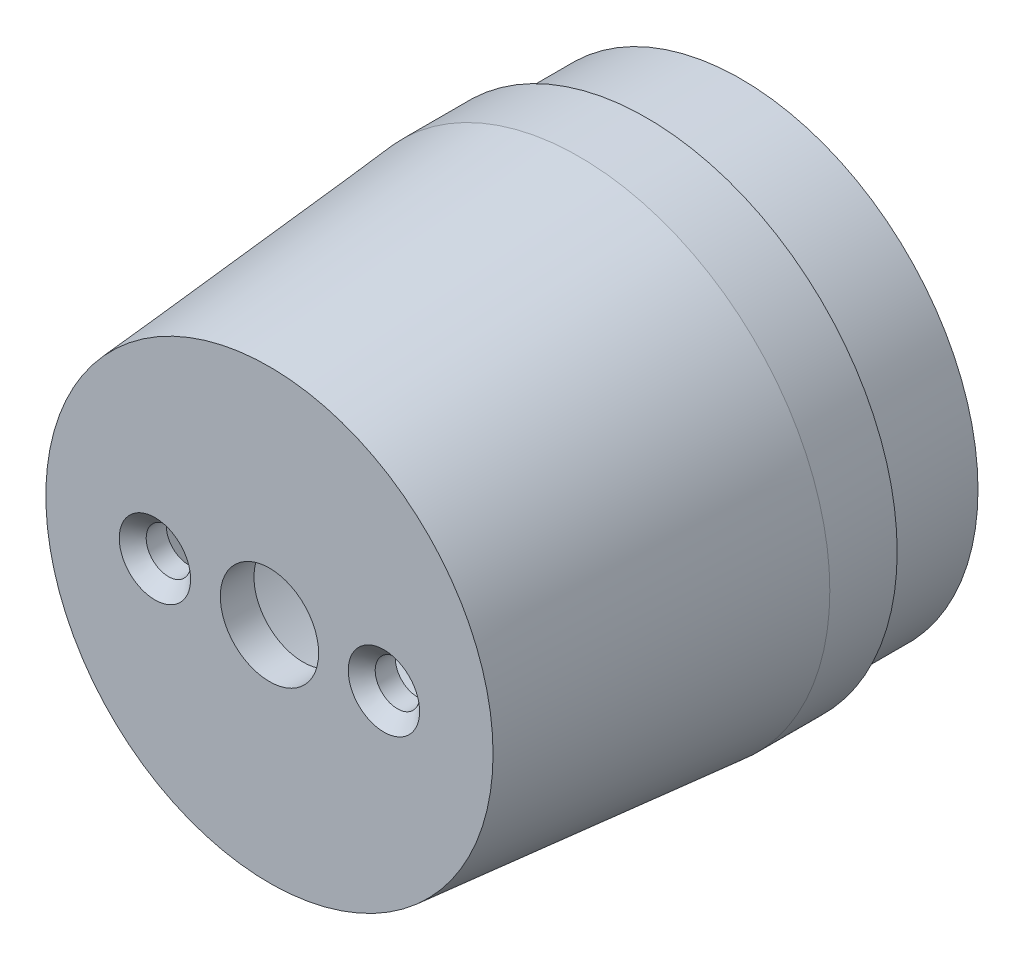
ISO-10303-21;
HEADER;
FILE_DESCRIPTION(('STEP AP214'),'2;1');
FILE_NAME('part.step','',(''),(''),'','','');
FILE_SCHEMA(('AUTOMOTIVE_DESIGN { 1 0 10303 214 1 1 1 1 }'));
ENDSEC;
DATA;
#1=APPLICATION_CONTEXT('core data for automotive mechanical design processes');
#2=APPLICATION_PROTOCOL_DEFINITION('international standard','automotive_design',2000,#1);
#3=PRODUCT_CONTEXT('',#1,'mechanical');
#4=PRODUCT('Part','Part','',(#3));
#5=PRODUCT_RELATED_PRODUCT_CATEGORY('part','',(#4));
#6=PRODUCT_DEFINITION_FORMATION('','',#4);
#7=PRODUCT_DEFINITION_CONTEXT('part definition',#1,'design');
#8=PRODUCT_DEFINITION('design','',#6,#7);
#9=PRODUCT_DEFINITION_SHAPE('','',#8);
#10=(LENGTH_UNIT() NAMED_UNIT(*) SI_UNIT(.MILLI.,.METRE.));
#11=(NAMED_UNIT(*) PLANE_ANGLE_UNIT() SI_UNIT($,.RADIAN.));
#12=(NAMED_UNIT(*) SI_UNIT($,.STERADIAN.) SOLID_ANGLE_UNIT());
#13=UNCERTAINTY_MEASURE_WITH_UNIT(LENGTH_MEASURE(1.E-05),#10,'distance_accuracy_value','');
#14=(GEOMETRIC_REPRESENTATION_CONTEXT(3) GLOBAL_UNCERTAINTY_ASSIGNED_CONTEXT((#13)) GLOBAL_UNIT_ASSIGNED_CONTEXT((#10,
#11,#12)) REPRESENTATION_CONTEXT('',''));
#15=CARTESIAN_POINT('',(0.,0.,0.));
#16=DIRECTION('',(0.,0.,1.));
#17=DIRECTION('',(1.,0.,0.));
#18=AXIS2_PLACEMENT_3D('',#15,#16,#17);
#19=CARTESIAN_POINT('',(0.,0.,0.));
#20=DIRECTION('',(0.,0.,1.));
#21=DIRECTION('',(1.,0.,0.));
#22=AXIS2_PLACEMENT_3D('',#19,#20,#21);
#23=CYLINDRICAL_SURFACE('',#22,18.6);
#24=CARTESIAN_POINT('',(0.,0.,-18.));
#25=DIRECTION('',(0.,0.,1.));
#26=DIRECTION('',(1.,0.,0.));
#27=AXIS2_PLACEMENT_3D('',#24,#25,#26);
#28=CIRCLE('',#27,18.6);
#29=CARTESIAN_POINT('',(18.6,0.,-18.));
#30=VERTEX_POINT('',#29);
#31=EDGE_CURVE('E66',#30,#30,#28,.T.);
#32=ORIENTED_EDGE('',*,*,#31,.T.);
#33=EDGE_LOOP('',(#32));
#34=FACE_BOUND('',#33,.T.);
#35=CARTESIAN_POINT('',(0.,0.,-13.));
#36=DIRECTION('',(0.,0.,1.));
#37=DIRECTION('',(1.,0.,0.));
#38=AXIS2_PLACEMENT_3D('',#35,#36,#37);
#39=CIRCLE('',#38,18.6);
#40=CARTESIAN_POINT('',(18.6,0.,-13.));
#41=VERTEX_POINT('',#40);
#42=EDGE_CURVE('E106',#41,#41,#39,.T.);
#43=ORIENTED_EDGE('',*,*,#42,.F.);
#44=EDGE_LOOP('',(#43));
#45=FACE_BOUND('',#44,.T.);
#46=ADVANCED_FACE('F32',(#34,#45),#23,.T.);
#47=CARTESIAN_POINT('',(0.,18.6,10.));
#48=DIRECTION('',(0.,0.,-1.));
#49=DIRECTION('',(-1.,0.,0.));
#50=AXIS2_PLACEMENT_3D('',#47,#48,#49);
#51=PLANE('',#50);
#52=CARTESIAN_POINT('',(0.,0.,10.));
#53=DIRECTION('',(0.,0.,1.));
#54=DIRECTION('',(1.,0.,0.));
#55=AXIS2_PLACEMENT_3D('',#52,#53,#54);
#56=CIRCLE('',#55,3.65);
#57=CARTESIAN_POINT('',(3.65,0.,10.));
#58=VERTEX_POINT('',#57);
#59=EDGE_CURVE('E69',#58,#58,#56,.T.);
#60=ORIENTED_EDGE('',*,*,#59,.F.);
#61=EDGE_LOOP('',(#60));
#62=FACE_BOUND('',#61,.T.);
#63=CARTESIAN_POINT('',(8.5,0.,10.));
#64=DIRECTION('',(0.,0.,-1.));
#65=DIRECTION('',(-1.,0.,0.));
#66=AXIS2_PLACEMENT_3D('',#63,#64,#65);
#67=CIRCLE('',#66,2.64999999999999);
#68=CARTESIAN_POINT('',(5.85000000000001,0.,10.));
#69=VERTEX_POINT('',#68);
#70=EDGE_CURVE('E43',#69,#69,#67,.T.);
#71=ORIENTED_EDGE('',*,*,#70,.T.);
#72=EDGE_LOOP('',(#71));
#73=FACE_BOUND('',#72,.T.);
#74=CARTESIAN_POINT('',(-8.5,0.,10.));
#75=DIRECTION('',(0.,0.,-1.));
#76=DIRECTION('',(-1.,0.,0.));
#77=AXIS2_PLACEMENT_3D('',#74,#75,#76);
#78=CIRCLE('',#77,2.65000000000001);
#79=CARTESIAN_POINT('',(-11.15,0.,10.));
#80=VERTEX_POINT('',#79);
#81=EDGE_CURVE('E39',#80,#80,#78,.T.);
#82=ORIENTED_EDGE('',*,*,#81,.T.);
#83=EDGE_LOOP('',(#82));
#84=FACE_BOUND('',#83,.T.);
#85=CARTESIAN_POINT('',(0.,0.,10.));
#86=DIRECTION('',(0.,0.,1.));
#87=DIRECTION('',(1.,0.,0.));
#88=AXIS2_PLACEMENT_3D('',#85,#86,#87);
#89=CIRCLE('',#88,16.6);
#90=CARTESIAN_POINT('',(16.6,0.,10.));
#91=VERTEX_POINT('',#90);
#92=EDGE_CURVE('E90',#91,#91,#89,.T.);
#93=ORIENTED_EDGE('',*,*,#92,.T.);
#94=EDGE_LOOP('',(#93));
#95=FACE_BOUND('',#94,.T.);
#96=ADVANCED_FACE('F114',(#62,#73,#84,#95),#51,.F.);
#97=CARTESIAN_POINT('',(0.,12.7,-25.));
#98=DIRECTION('',(0.,0.,1.));
#99=DIRECTION('',(1.,0.,0.));
#100=AXIS2_PLACEMENT_3D('',#97,#98,#99);
#101=PLANE('',#100);
#102=CARTESIAN_POINT('',(-10.6066017177982,10.6066017177982,-25.));
#103=DIRECTION('',(0.,0.,-1.));
#104=DIRECTION('',(-1.,0.,0.));
#105=AXIS2_PLACEMENT_3D('',#102,#103,#104);
#106=CIRCLE('',#105,1.00000000000002);
#107=CARTESIAN_POINT('',(-11.6066017177982,10.6066017177982,-25.));
#108=VERTEX_POINT('',#107);
#109=EDGE_CURVE('E99',#108,#108,#106,.T.);
#110=ORIENTED_EDGE('',*,*,#109,.F.);
#111=EDGE_LOOP('',(#110));
#112=FACE_BOUND('',#111,.T.);
#113=CARTESIAN_POINT('',(-10.6066017177982,-10.6066017177982,-25.));
#114=DIRECTION('',(0.,0.,-1.));
#115=DIRECTION('',(-1.,0.,0.));
#116=AXIS2_PLACEMENT_3D('',#113,#114,#115);
#117=CIRCLE('',#116,1.00000000000007);
#118=CARTESIAN_POINT('',(-11.6066017177983,-10.6066017177982,-25.));
#119=VERTEX_POINT('',#118);
#120=EDGE_CURVE('E93',#119,#119,#117,.T.);
#121=ORIENTED_EDGE('',*,*,#120,.F.);
#122=EDGE_LOOP('',(#121));
#123=FACE_BOUND('',#122,.T.);
#124=CARTESIAN_POINT('',(10.6066017177982,-10.6066017177982,-25.));
#125=DIRECTION('',(0.,0.,-1.));
#126=DIRECTION('',(-1.,0.,0.));
#127=AXIS2_PLACEMENT_3D('',#124,#125,#126);
#128=CIRCLE('',#127,1.00000000000012);
#129=CARTESIAN_POINT('',(9.60660171779809,-10.6066017177982,-25.));
#130=VERTEX_POINT('',#129);
#131=EDGE_CURVE('E86',#130,#130,#128,.T.);
#132=ORIENTED_EDGE('',*,*,#131,.F.);
#133=EDGE_LOOP('',(#132));
#134=FACE_BOUND('',#133,.T.);
#135=CARTESIAN_POINT('',(10.6066017177982,10.6066017177982,-25.));
#136=DIRECTION('',(0.,0.,-1.));
#137=DIRECTION('',(-1.,0.,0.));
#138=AXIS2_PLACEMENT_3D('',#135,#136,#137);
#139=CIRCLE('',#138,1.);
#140=CARTESIAN_POINT('',(9.60660171779823,10.6066017177982,-25.));
#141=VERTEX_POINT('',#140);
#142=EDGE_CURVE('E80',#141,#141,#139,.T.);
#143=ORIENTED_EDGE('',*,*,#142,.F.);
#144=EDGE_LOOP('',(#143));
#145=FACE_BOUND('',#144,.T.);
#146=CARTESIAN_POINT('',(0.,0.,-25.));
#147=DIRECTION('',(0.,0.,1.));
#148=DIRECTION('',(1.,0.,0.));
#149=AXIS2_PLACEMENT_3D('',#146,#147,#148);
#150=CIRCLE('',#149,17.6);
#151=CARTESIAN_POINT('',(17.6,0.,-25.));
#152=VERTEX_POINT('',#151);
#153=EDGE_CURVE('E52',#152,#152,#150,.T.);
#154=ORIENTED_EDGE('',*,*,#153,.F.);
#155=EDGE_LOOP('',(#154));
#156=FACE_BOUND('',#155,.T.);
#157=CARTESIAN_POINT('',(0.,0.,-25.));
#158=DIRECTION('',(0.,0.,1.));
#159=DIRECTION('',(1.,0.,0.));
#160=AXIS2_PLACEMENT_3D('',#157,#158,#159);
#161=CIRCLE('',#160,12.7);
#162=CARTESIAN_POINT('',(12.7,0.,-25.));
#163=VERTEX_POINT('',#162);
#164=EDGE_CURVE('E60',#163,#163,#161,.T.);
#165=ORIENTED_EDGE('',*,*,#164,.T.);
#166=EDGE_LOOP('',(#165));
#167=FACE_BOUND('',#166,.T.);
#168=ADVANCED_FACE('F120',(#112,#123,#134,#145,#156,#167),#101,.F.);
#169=CARTESIAN_POINT('',(0.,0.,0.));
#170=DIRECTION('',(0.,0.,1.));
#171=DIRECTION('',(1.,0.,0.));
#172=AXIS2_PLACEMENT_3D('',#169,#170,#171);
#173=CYLINDRICAL_SURFACE('',#172,17.6);
#174=CARTESIAN_POINT('',(0.,0.,-18.));
#175=DIRECTION('',(0.,0.,1.));
#176=DIRECTION('',(1.,0.,0.));
#177=AXIS2_PLACEMENT_3D('',#174,#175,#176);
#178=CIRCLE('',#177,17.6);
#179=CARTESIAN_POINT('',(17.6,0.,-18.));
#180=VERTEX_POINT('',#179);
#181=EDGE_CURVE('E63',#180,#180,#178,.T.);
#182=ORIENTED_EDGE('',*,*,#181,.F.);
#183=EDGE_LOOP('',(#182));
#184=FACE_BOUND('',#183,.T.);
#185=ORIENTED_EDGE('',*,*,#153,.T.);
#186=EDGE_LOOP('',(#185));
#187=FACE_BOUND('',#186,.T.);
#188=ADVANCED_FACE('F129',(#184,#187),#173,.T.);
#189=CARTESIAN_POINT('',(0.,17.6,-18.));
#190=DIRECTION('',(0.,0.,1.));
#191=DIRECTION('',(1.,0.,0.));
#192=AXIS2_PLACEMENT_3D('',#189,#190,#191);
#193=PLANE('',#192);
#194=ORIENTED_EDGE('',*,*,#31,.F.);
#195=EDGE_LOOP('',(#194));
#196=FACE_BOUND('',#195,.T.);
#197=ORIENTED_EDGE('',*,*,#181,.T.);
#198=EDGE_LOOP('',(#197));
#199=FACE_BOUND('',#198,.T.);
#200=ADVANCED_FACE('F125',(#196,#199),#193,.F.);
#201=CARTESIAN_POINT('',(0.,0.,0.));
#202=DIRECTION('',(0.,0.,1.));
#203=DIRECTION('',(1.,0.,0.));
#204=AXIS2_PLACEMENT_3D('',#201,#202,#203);
#205=CYLINDRICAL_SURFACE('',#204,3.65);
#206=CARTESIAN_POINT('',(0.,0.,7.5));
#207=DIRECTION('',(0.,0.,1.));
#208=DIRECTION('',(1.,0.,0.));
#209=AXIS2_PLACEMENT_3D('',#206,#207,#208);
#210=CIRCLE('',#209,3.65);
#211=CARTESIAN_POINT('',(3.65,0.,7.5));
#212=VERTEX_POINT('',#211);
#213=EDGE_CURVE('E72',#212,#212,#210,.T.);
#214=ORIENTED_EDGE('',*,*,#213,.F.);
#215=EDGE_LOOP('',(#214));
#216=FACE_BOUND('',#215,.T.);
#217=ORIENTED_EDGE('',*,*,#59,.T.);
#218=EDGE_LOOP('',(#217));
#219=FACE_BOUND('',#218,.T.);
#220=ADVANCED_FACE('F128',(#216,#219),#205,.F.);
#221=CARTESIAN_POINT('',(0.,3.65,7.5));
#222=DIRECTION('',(0.,0.,1.));
#223=DIRECTION('',(1.,0.,0.));
#224=AXIS2_PLACEMENT_3D('',#221,#222,#223);
#225=PLANE('',#224);
#226=CARTESIAN_POINT('',(-8.5,0.,7.5));
#227=DIRECTION('',(0.,0.,1.));
#228=DIRECTION('',(1.,0.,0.));
#229=AXIS2_PLACEMENT_3D('',#226,#227,#228);
#230=CIRCLE('',#229,1.65);
#231=CARTESIAN_POINT('',(-6.85,0.,7.5));
#232=VERTEX_POINT('',#231);
#233=EDGE_CURVE('E53',#232,#232,#230,.T.);
#234=ORIENTED_EDGE('',*,*,#233,.T.);
#235=EDGE_LOOP('',(#234));
#236=FACE_BOUND('',#235,.T.);
#237=CARTESIAN_POINT('',(8.5,0.,7.5));
#238=DIRECTION('',(0.,0.,1.));
#239=DIRECTION('',(1.,0.,0.));
#240=AXIS2_PLACEMENT_3D('',#237,#238,#239);
#241=CIRCLE('',#240,1.65);
#242=CARTESIAN_POINT('',(10.15,0.,7.5));
#243=VERTEX_POINT('',#242);
#244=EDGE_CURVE('E56',#243,#243,#241,.T.);
#245=ORIENTED_EDGE('',*,*,#244,.T.);
#246=EDGE_LOOP('',(#245));
#247=FACE_BOUND('',#246,.T.);
#248=CARTESIAN_POINT('',(0.,0.,7.5));
#249=DIRECTION('',(0.,0.,1.));
#250=DIRECTION('',(1.,0.,0.));
#251=AXIS2_PLACEMENT_3D('',#248,#249,#250);
#252=CIRCLE('',#251,12.7);
#253=CARTESIAN_POINT('',(12.7,0.,7.5));
#254=VERTEX_POINT('',#253);
#255=EDGE_CURVE('E75',#254,#254,#252,.T.);
#256=ORIENTED_EDGE('',*,*,#255,.F.);
#257=EDGE_LOOP('',(#256));
#258=FACE_BOUND('',#257,.T.);
#259=ORIENTED_EDGE('',*,*,#213,.T.);
#260=EDGE_LOOP('',(#259));
#261=FACE_BOUND('',#260,.T.);
#262=ADVANCED_FACE('F154',(#236,#247,#258,#261),#225,.F.);
#263=CARTESIAN_POINT('',(0.,0.,0.));
#264=DIRECTION('',(0.,0.,1.));
#265=DIRECTION('',(1.,0.,0.));
#266=AXIS2_PLACEMENT_3D('',#263,#264,#265);
#267=CYLINDRICAL_SURFACE('',#266,12.7);
#268=ORIENTED_EDGE('',*,*,#164,.F.);
#269=EDGE_LOOP('',(#268));
#270=FACE_BOUND('',#269,.T.);
#271=ORIENTED_EDGE('',*,*,#255,.T.);
#272=EDGE_LOOP('',(#271));
#273=FACE_BOUND('',#272,.T.);
#274=ADVANCED_FACE('F157',(#270,#273),#267,.F.);
#275=CARTESIAN_POINT('',(8.5,0.,5.5));
#276=DIRECTION('',(0.,0.,1.));
#277=DIRECTION('',(1.,0.,0.));
#278=AXIS2_PLACEMENT_3D('',#275,#276,#277);
#279=CYLINDRICAL_SURFACE('',#278,1.65);
#280=CARTESIAN_POINT('',(8.5,0.,9.00000000000001));
#281=DIRECTION('',(0.,0.,-1.));
#282=DIRECTION('',(-1.,0.,0.));
#283=AXIS2_PLACEMENT_3D('',#280,#281,#282);
#284=CIRCLE('',#283,1.65);
#285=CARTESIAN_POINT('',(6.85,0.,9.00000000000001));
#286=VERTEX_POINT('',#285);
#287=EDGE_CURVE('E10',#286,#286,#284,.F.);
#288=ORIENTED_EDGE('',*,*,#287,.T.);
#289=EDGE_LOOP('',(#288));
#290=FACE_BOUND('',#289,.T.);
#291=ORIENTED_EDGE('',*,*,#244,.F.);
#292=EDGE_LOOP('',(#291));
#293=FACE_BOUND('',#292,.T.);
#294=ADVANCED_FACE('F146',(#290,#293),#279,.F.);
#295=CARTESIAN_POINT('',(-8.5,0.,5.5));
#296=DIRECTION('',(0.,0.,1.));
#297=DIRECTION('',(1.,0.,0.));
#298=AXIS2_PLACEMENT_3D('',#295,#296,#297);
#299=CYLINDRICAL_SURFACE('',#298,1.65);
#300=CARTESIAN_POINT('',(-8.5,0.,9.));
#301=DIRECTION('',(0.,0.,-1.));
#302=DIRECTION('',(-1.,0.,0.));
#303=AXIS2_PLACEMENT_3D('',#300,#301,#302);
#304=CIRCLE('',#303,1.65);
#305=CARTESIAN_POINT('',(-10.15,0.,9.));
#306=VERTEX_POINT('',#305);
#307=EDGE_CURVE('E47',#306,#306,#304,.F.);
#308=ORIENTED_EDGE('',*,*,#307,.T.);
#309=EDGE_LOOP('',(#308));
#310=FACE_BOUND('',#309,.T.);
#311=ORIENTED_EDGE('',*,*,#233,.F.);
#312=EDGE_LOOP('',(#311));
#313=FACE_BOUND('',#312,.T.);
#314=ADVANCED_FACE('F138',(#310,#313),#299,.F.);
#315=CARTESIAN_POINT('',(-8.5,0.,9.));
#316=DIRECTION('',(0.,0.,1.));
#317=DIRECTION('',(1.,0.,0.));
#318=AXIS2_PLACEMENT_3D('',#315,#316,#317);
#319=CONICAL_SURFACE('',#318,1.65,0.785398163397452);
#320=ORIENTED_EDGE('',*,*,#81,.F.);
#321=EDGE_LOOP('',(#320));
#322=FACE_BOUND('',#321,.T.);
#323=ORIENTED_EDGE('',*,*,#307,.F.);
#324=EDGE_LOOP('',(#323));
#325=FACE_BOUND('',#324,.T.);
#326=ADVANCED_FACE('F136',(#322,#325),#319,.F.);
#327=CARTESIAN_POINT('',(8.5,0.,9.00000000000001));
#328=DIRECTION('',(0.,0.,1.));
#329=DIRECTION('',(1.,0.,0.));
#330=AXIS2_PLACEMENT_3D('',#327,#328,#329);
#331=CONICAL_SURFACE('',#330,1.65,0.785398163397449);
#332=ORIENTED_EDGE('',*,*,#70,.F.);
#333=EDGE_LOOP('',(#332));
#334=FACE_BOUND('',#333,.T.);
#335=ORIENTED_EDGE('',*,*,#287,.F.);
#336=EDGE_LOOP('',(#335));
#337=FACE_BOUND('',#336,.T.);
#338=ADVANCED_FACE('F34',(#334,#337),#331,.F.);
#339=CARTESIAN_POINT('',(10.6066017177982,10.6066017177982,0.));
#340=DIRECTION('',(0.,0.,-1.));
#341=DIRECTION('',(-1.,0.,0.));
#342=AXIS2_PLACEMENT_3D('',#339,#340,#341);
#343=CYLINDRICAL_SURFACE('',#342,1.);
#344=CARTESIAN_POINT('',(10.6066017177982,10.6066017177982,0.));
#345=DIRECTION('',(0.,0.,-1.));
#346=DIRECTION('',(-1.,0.,0.));
#347=AXIS2_PLACEMENT_3D('',#344,#345,#346);
#348=CIRCLE('',#347,1.);
#349=CARTESIAN_POINT('',(9.60660171779823,10.6066017177982,0.));
#350=VERTEX_POINT('',#349);
#351=EDGE_CURVE('E57',#350,#350,#348,.T.);
#352=ORIENTED_EDGE('',*,*,#351,.F.);
#353=EDGE_LOOP('',(#352));
#354=FACE_BOUND('',#353,.T.);
#355=ORIENTED_EDGE('',*,*,#142,.T.);
#356=EDGE_LOOP('',(#355));
#357=FACE_BOUND('',#356,.T.);
#358=ADVANCED_FACE('F144',(#354,#357),#343,.F.);
#359=CARTESIAN_POINT('',(10.6066017177982,10.6066017177982,0.));
#360=DIRECTION('',(0.,0.,-1.));
#361=DIRECTION('',(-1.,0.,0.));
#362=AXIS2_PLACEMENT_3D('',#359,#360,#361);
#363=PLANE('',#362);
#364=ORIENTED_EDGE('',*,*,#351,.T.);
#365=EDGE_LOOP('',(#364));
#366=FACE_BOUND('',#365,.T.);
#367=ADVANCED_FACE('F200',(#366),#363,.T.);
#368=CARTESIAN_POINT('',(10.6066017177982,-10.6066017177982,0.));
#369=DIRECTION('',(0.,0.,-1.));
#370=DIRECTION('',(-1.,0.,0.));
#371=AXIS2_PLACEMENT_3D('',#368,#369,#370);
#372=CYLINDRICAL_SURFACE('',#371,1.00000000000012);
#373=CARTESIAN_POINT('',(10.6066017177982,-10.6066017177982,0.));
#374=DIRECTION('',(0.,0.,-1.));
#375=DIRECTION('',(-1.,0.,0.));
#376=AXIS2_PLACEMENT_3D('',#373,#374,#375);
#377=CIRCLE('',#376,1.00000000000012);
#378=CARTESIAN_POINT('',(9.60660171779809,-10.6066017177982,0.));
#379=VERTEX_POINT('',#378);
#380=EDGE_CURVE('E89',#379,#379,#377,.T.);
#381=ORIENTED_EDGE('',*,*,#380,.F.);
#382=EDGE_LOOP('',(#381));
#383=FACE_BOUND('',#382,.T.);
#384=ORIENTED_EDGE('',*,*,#131,.T.);
#385=EDGE_LOOP('',(#384));
#386=FACE_BOUND('',#385,.T.);
#387=ADVANCED_FACE('F196',(#383,#386),#372,.F.);
#388=CARTESIAN_POINT('',(10.6066017177982,-10.6066017177982,0.));
#389=DIRECTION('',(0.,0.,-1.));
#390=DIRECTION('',(-1.,0.,0.));
#391=AXIS2_PLACEMENT_3D('',#388,#389,#390);
#392=PLANE('',#391);
#393=ORIENTED_EDGE('',*,*,#380,.T.);
#394=EDGE_LOOP('',(#393));
#395=FACE_BOUND('',#394,.T.);
#396=ADVANCED_FACE('F192',(#395),#392,.T.);
#397=CARTESIAN_POINT('',(-10.6066017177982,-10.6066017177982,0.));
#398=DIRECTION('',(0.,0.,-1.));
#399=DIRECTION('',(-1.,0.,0.));
#400=AXIS2_PLACEMENT_3D('',#397,#398,#399);
#401=CYLINDRICAL_SURFACE('',#400,1.00000000000007);
#402=CARTESIAN_POINT('',(-10.6066017177982,-10.6066017177982,0.));
#403=DIRECTION('',(0.,0.,-1.));
#404=DIRECTION('',(-1.,0.,0.));
#405=AXIS2_PLACEMENT_3D('',#402,#403,#404);
#406=CIRCLE('',#405,1.00000000000007);
#407=CARTESIAN_POINT('',(-11.6066017177983,-10.6066017177982,0.));
#408=VERTEX_POINT('',#407);
#409=EDGE_CURVE('E96',#408,#408,#406,.T.);
#410=ORIENTED_EDGE('',*,*,#409,.F.);
#411=EDGE_LOOP('',(#410));
#412=FACE_BOUND('',#411,.T.);
#413=ORIENTED_EDGE('',*,*,#120,.T.);
#414=EDGE_LOOP('',(#413));
#415=FACE_BOUND('',#414,.T.);
#416=ADVANCED_FACE('F188',(#412,#415),#401,.F.);
#417=CARTESIAN_POINT('',(-10.6066017177982,-10.6066017177982,0.));
#418=DIRECTION('',(0.,0.,-1.));
#419=DIRECTION('',(-1.,0.,0.));
#420=AXIS2_PLACEMENT_3D('',#417,#418,#419);
#421=PLANE('',#420);
#422=ORIENTED_EDGE('',*,*,#409,.T.);
#423=EDGE_LOOP('',(#422));
#424=FACE_BOUND('',#423,.T.);
#425=ADVANCED_FACE('F184',(#424),#421,.T.);
#426=CARTESIAN_POINT('',(-10.6066017177982,10.6066017177982,0.));
#427=DIRECTION('',(0.,0.,-1.));
#428=DIRECTION('',(-1.,0.,0.));
#429=AXIS2_PLACEMENT_3D('',#426,#427,#428);
#430=CYLINDRICAL_SURFACE('',#429,1.00000000000002);
#431=CARTESIAN_POINT('',(-10.6066017177982,10.6066017177982,0.));
#432=DIRECTION('',(0.,0.,-1.));
#433=DIRECTION('',(-1.,0.,0.));
#434=AXIS2_PLACEMENT_3D('',#431,#432,#433);
#435=CIRCLE('',#434,1.00000000000002);
#436=CARTESIAN_POINT('',(-11.6066017177982,10.6066017177982,0.));
#437=VERTEX_POINT('',#436);
#438=EDGE_CURVE('E83',#437,#437,#435,.T.);
#439=ORIENTED_EDGE('',*,*,#438,.F.);
#440=EDGE_LOOP('',(#439));
#441=FACE_BOUND('',#440,.T.);
#442=ORIENTED_EDGE('',*,*,#109,.T.);
#443=EDGE_LOOP('',(#442));
#444=FACE_BOUND('',#443,.T.);
#445=ADVANCED_FACE('F178',(#441,#444),#430,.F.);
#446=CARTESIAN_POINT('',(-10.6066017177982,10.6066017177982,0.));
#447=DIRECTION('',(0.,0.,-1.));
#448=DIRECTION('',(-1.,0.,0.));
#449=AXIS2_PLACEMENT_3D('',#446,#447,#448);
#450=PLANE('',#449);
#451=ORIENTED_EDGE('',*,*,#438,.T.);
#452=EDGE_LOOP('',(#451));
#453=FACE_BOUND('',#452,.T.);
#454=ADVANCED_FACE('F173',(#453),#450,.T.);
#455=CARTESIAN_POINT('',(0.,0.,10.));
#456=DIRECTION('',(0.,0.,-1.));
#457=DIRECTION('',(-1.,0.,0.));
#458=AXIS2_PLACEMENT_3D('',#455,#456,#457);
#459=CONICAL_SURFACE('',#458,16.6,0.0867383386759852);
#460=ORIENTED_EDGE('',*,*,#42,.T.);
#461=EDGE_LOOP('',(#460));
#462=FACE_BOUND('',#461,.T.);
#463=ORIENTED_EDGE('',*,*,#92,.F.);
#464=EDGE_LOOP('',(#463));
#465=FACE_BOUND('',#464,.T.);
#466=ADVANCED_FACE('F110',(#462,#465),#459,.T.);
#467=CLOSED_SHELL('',(#46,#96,#168,#188,#200,#220,#262,#274,#294,#314,#326,#338,#358,#367,#387,
#396,#416,#425,#445,#454,#466));
#468=MANIFOLD_SOLID_BREP('B2',#467);
#469=ADVANCED_BREP_SHAPE_REPRESENTATION('',(#18,#468),#14);
#470=SHAPE_DEFINITION_REPRESENTATION(#9,#469);
ENDSEC;
END-ISO-10303-21;
